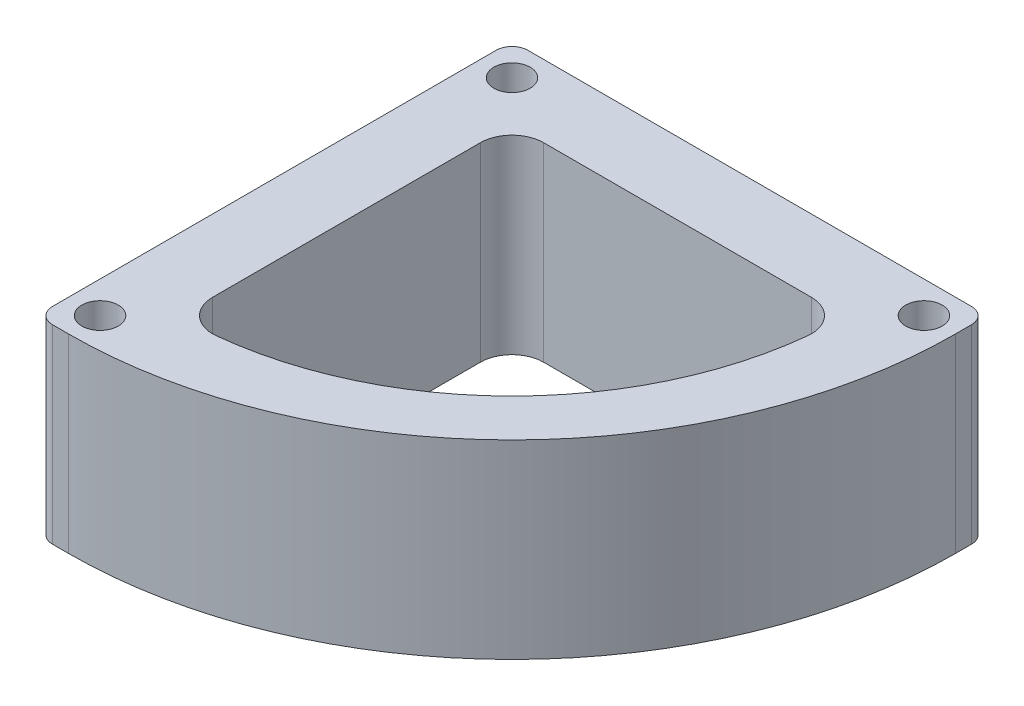
ISO-10303-21;
HEADER;
FILE_DESCRIPTION(('STEP AP214'),'2;1');
FILE_NAME('part.step','',(''),(''),'','','');
FILE_SCHEMA(('AUTOMOTIVE_DESIGN { 1 0 10303 214 1 1 1 1 }'));
ENDSEC;
DATA;
#1=APPLICATION_CONTEXT('core data for automotive mechanical design processes');
#2=APPLICATION_PROTOCOL_DEFINITION('international standard','automotive_design',2000,#1);
#3=PRODUCT_CONTEXT('',#1,'mechanical');
#4=PRODUCT('Part','Part','',(#3));
#5=PRODUCT_RELATED_PRODUCT_CATEGORY('part','',(#4));
#6=PRODUCT_DEFINITION_FORMATION('','',#4);
#7=PRODUCT_DEFINITION_CONTEXT('part definition',#1,'design');
#8=PRODUCT_DEFINITION('design','',#6,#7);
#9=PRODUCT_DEFINITION_SHAPE('','',#8);
#10=(LENGTH_UNIT() NAMED_UNIT(*) SI_UNIT(.MILLI.,.METRE.));
#11=(NAMED_UNIT(*) PLANE_ANGLE_UNIT() SI_UNIT($,.RADIAN.));
#12=(NAMED_UNIT(*) SI_UNIT($,.STERADIAN.) SOLID_ANGLE_UNIT());
#13=UNCERTAINTY_MEASURE_WITH_UNIT(LENGTH_MEASURE(1.E-05),#10,'distance_accuracy_value','');
#14=(GEOMETRIC_REPRESENTATION_CONTEXT(3) GLOBAL_UNCERTAINTY_ASSIGNED_CONTEXT((#13)) GLOBAL_UNIT_ASSIGNED_CONTEXT((#10,
#11,#12)) REPRESENTATION_CONTEXT('',''));
#15=CARTESIAN_POINT('',(0.,0.,0.));
#16=DIRECTION('',(0.,0.,1.));
#17=DIRECTION('',(1.,0.,0.));
#18=AXIS2_PLACEMENT_3D('',#15,#16,#17);
#19=CARTESIAN_POINT('',(0.,12.,0.));
#20=DIRECTION('',(0.,1.,0.));
#21=DIRECTION('',(0.,0.,1.));
#22=AXIS2_PLACEMENT_3D('',#19,#20,#21);
#23=PLANE('',#22);
#24=CARTESIAN_POINT('',(-13.,12.,13.));
#25=DIRECTION('',(0.,1.,0.));
#26=DIRECTION('',(0.,0.,1.));
#27=AXIS2_PLACEMENT_3D('',#24,#25,#26);
#28=CIRCLE('',#27,1.15);
#29=CARTESIAN_POINT('',(-13.,12.,14.15));
#30=VERTEX_POINT('',#29);
#31=EDGE_CURVE('E220',#30,#30,#28,.T.);
#32=ORIENTED_EDGE('',*,*,#31,.F.);
#33=EDGE_LOOP('',(#32));
#34=FACE_BOUND('',#33,.T.);
#35=CARTESIAN_POINT('',(13.,12.,-13.));
#36=DIRECTION('',(0.,1.,0.));
#37=DIRECTION('',(0.,0.,1.));
#38=AXIS2_PLACEMENT_3D('',#35,#36,#37);
#39=CIRCLE('',#38,1.15);
#40=CARTESIAN_POINT('',(13.,12.,-11.85));
#41=VERTEX_POINT('',#40);
#42=EDGE_CURVE('E228',#41,#41,#39,.T.);
#43=ORIENTED_EDGE('',*,*,#42,.F.);
#44=EDGE_LOOP('',(#43));
#45=FACE_BOUND('',#44,.T.);
#46=DIRECTION('',(-1.,0.,0.));
#47=VECTOR('',#46,1.);
#48=CARTESIAN_POINT('',(-15.,12.,-15.));
#49=LINE('',#48,#47);
#50=CARTESIAN_POINT('',(14.,12.,-15.));
#51=VERTEX_POINT('',#50);
#52=CARTESIAN_POINT('',(-14.,12.,-15.));
#53=VERTEX_POINT('',#52);
#54=EDGE_CURVE('E240',#51,#53,#49,.T.);
#55=ORIENTED_EDGE('',*,*,#54,.T.);
#56=CARTESIAN_POINT('',(-14.,12.,-14.));
#57=DIRECTION('',(0.,1.,0.));
#58=DIRECTION('',(0.,0.,1.));
#59=AXIS2_PLACEMENT_3D('',#56,#57,#58);
#60=CIRCLE('',#59,1.);
#61=CARTESIAN_POINT('',(-15.,12.,-14.));
#62=VERTEX_POINT('',#61);
#63=EDGE_CURVE('E309',#53,#62,#60,.T.);
#64=ORIENTED_EDGE('',*,*,#63,.T.);
#65=DIRECTION('',(0.,0.,1.));
#66=VECTOR('',#65,1.);
#67=CARTESIAN_POINT('',(-15.,12.,-15.));
#68=LINE('',#67,#66);
#69=CARTESIAN_POINT('',(-15.,12.,14.));
#70=VERTEX_POINT('',#69);
#71=EDGE_CURVE('E245',#62,#70,#68,.T.);
#72=ORIENTED_EDGE('',*,*,#71,.T.);
#73=CARTESIAN_POINT('',(-14.,12.,14.));
#74=DIRECTION('',(0.,1.,0.));
#75=DIRECTION('',(0.,0.,1.));
#76=AXIS2_PLACEMENT_3D('',#73,#74,#75);
#77=CIRCLE('',#76,1.);
#78=CARTESIAN_POINT('',(-14.,12.,15.));
#79=VERTEX_POINT('',#78);
#80=EDGE_CURVE('E303',#70,#79,#77,.T.);
#81=ORIENTED_EDGE('',*,*,#80,.T.);
#82=DIRECTION('',(1.,0.,0.));
#83=VECTOR('',#82,1.);
#84=CARTESIAN_POINT('',(-15.,12.,15.));
#85=LINE('',#84,#83);
#86=CARTESIAN_POINT('',(-13.,12.,15.));
#87=VERTEX_POINT('',#86);
#88=EDGE_CURVE('E249',#79,#87,#85,.T.);
#89=ORIENTED_EDGE('',*,*,#88,.T.);
#90=CARTESIAN_POINT('',(-13.,12.,-13.));
#91=DIRECTION('',(0.,1.,0.));
#92=DIRECTION('',(0.,0.,1.));
#93=AXIS2_PLACEMENT_3D('',#90,#91,#92);
#94=CIRCLE('',#93,28.);
#95=CARTESIAN_POINT('',(15.,12.,-13.));
#96=VERTEX_POINT('',#95);
#97=EDGE_CURVE('E277',#87,#96,#94,.T.);
#98=ORIENTED_EDGE('',*,*,#97,.T.);
#99=DIRECTION('',(0.,0.,-1.));
#100=VECTOR('',#99,1.);
#101=CARTESIAN_POINT('',(15.,12.,-15.));
#102=LINE('',#101,#100);
#103=CARTESIAN_POINT('',(15.,12.,-14.));
#104=VERTEX_POINT('',#103);
#105=EDGE_CURVE('E236',#96,#104,#102,.T.);
#106=ORIENTED_EDGE('',*,*,#105,.T.);
#107=CARTESIAN_POINT('',(14.,12.,-14.));
#108=DIRECTION('',(0.,1.,0.));
#109=DIRECTION('',(0.,0.,1.));
#110=AXIS2_PLACEMENT_3D('',#107,#108,#109);
#111=CIRCLE('',#110,1.);
#112=EDGE_CURVE('E306',#104,#51,#111,.T.);
#113=ORIENTED_EDGE('',*,*,#112,.T.);
#114=EDGE_LOOP('',(#55,#64,#72,#81,#89,#98,#106,#113));
#115=FACE_BOUND('',#114,.T.);
#116=CARTESIAN_POINT('',(-13.,12.,-13.));
#117=DIRECTION('',(0.,1.,0.));
#118=DIRECTION('',(0.,0.,-1.));
#119=AXIS2_PLACEMENT_3D('',#116,#117,#118);
#120=CIRCLE('',#119,1.15);
#121=CARTESIAN_POINT('',(-13.,12.,-14.15));
#122=VERTEX_POINT('',#121);
#123=EDGE_CURVE('E212',#122,#122,#120,.T.);
#124=ORIENTED_EDGE('',*,*,#123,.F.);
#125=EDGE_LOOP('',(#124));
#126=FACE_BOUND('',#125,.T.);
#127=DIRECTION('',(0.,0.,-1.));
#128=VECTOR('',#127,1.);
#129=CARTESIAN_POINT('',(-10.4472218138456,12.,0.));
#130=LINE('',#129,#128);
#131=CARTESIAN_POINT('',(-10.4472218138456,12.,8.44722181384558));
#132=VERTEX_POINT('',#131);
#133=CARTESIAN_POINT('',(-10.4472218138456,12.,-8.44722181384558));
#134=VERTEX_POINT('',#133);
#135=EDGE_CURVE('E206',#132,#134,#130,.T.);
#136=ORIENTED_EDGE('',*,*,#135,.T.);
#137=CARTESIAN_POINT('',(-8.44722181384559,12.,-8.44722181384559));
#138=DIRECTION('',(0.,1.,0.));
#139=DIRECTION('',(0.,0.,1.));
#140=AXIS2_PLACEMENT_3D('',#137,#138,#139);
#141=CIRCLE('',#140,2.);
#142=CARTESIAN_POINT('',(-8.44722181384559,12.,-10.4472218138456));
#143=VERTEX_POINT('',#142);
#144=EDGE_CURVE('E143',#134,#143,#141,.F.);
#145=ORIENTED_EDGE('',*,*,#144,.T.);
#146=DIRECTION('',(1.,0.,0.));
#147=VECTOR('',#146,1.);
#148=CARTESIAN_POINT('',(0.,12.,-10.4472218138456));
#149=LINE('',#148,#147);
#150=CARTESIAN_POINT('',(8.44722181384559,12.,-10.4472218138456));
#151=VERTEX_POINT('',#150);
#152=EDGE_CURVE('E147',#143,#151,#149,.T.);
#153=ORIENTED_EDGE('',*,*,#152,.T.);
#154=CARTESIAN_POINT('',(8.44722181384559,12.,-8.44722181384559));
#155=DIRECTION('',(0.,1.,0.));
#156=DIRECTION('',(0.,0.,1.));
#157=AXIS2_PLACEMENT_3D('',#154,#155,#156);
#158=CIRCLE('',#157,2.00000000000001);
#159=CARTESIAN_POINT('',(10.4361106167605,12.,-8.23669549805611));
#160=VERTEX_POINT('',#159);
#161=EDGE_CURVE('E194',#151,#160,#158,.F.);
#162=ORIENTED_EDGE('',*,*,#161,.T.);
#163=CARTESIAN_POINT('',(-10.4472218138457,12.,-10.4472218138457));
#164=DIRECTION('',(0.,1.,0.));
#165=DIRECTION('',(0.,0.,1.));
#166=AXIS2_PLACEMENT_3D('',#163,#164,#165);
#167=CIRCLE('',#166,21.0000000000001);
#168=CARTESIAN_POINT('',(-8.2366954980561,12.,10.4361106167605));
#169=VERTEX_POINT('',#168);
#170=EDGE_CURVE('E198',#160,#169,#167,.F.);
#171=ORIENTED_EDGE('',*,*,#170,.T.);
#172=CARTESIAN_POINT('',(-8.44722181384559,12.,8.44722181384559));
#173=DIRECTION('',(0.,1.,0.));
#174=DIRECTION('',(0.,0.,1.));
#175=AXIS2_PLACEMENT_3D('',#172,#173,#174);
#176=CIRCLE('',#175,2.);
#177=EDGE_CURVE('E202',#169,#132,#176,.F.);
#178=ORIENTED_EDGE('',*,*,#177,.T.);
#179=EDGE_LOOP('',(#136,#145,#153,#162,#171,#178));
#180=FACE_BOUND('',#179,.T.);
#181=ADVANCED_FACE('F38',(#34,#45,#115,#126,#180),#23,.T.);
#182=CARTESIAN_POINT('',(0.,0.,0.));
#183=DIRECTION('',(0.,1.,0.));
#184=DIRECTION('',(0.,0.,1.));
#185=AXIS2_PLACEMENT_3D('',#182,#183,#184);
#186=PLANE('',#185);
#187=CARTESIAN_POINT('',(-13.,0.,-13.));
#188=DIRECTION('',(0.,1.,0.));
#189=DIRECTION('',(0.,0.,-1.));
#190=AXIS2_PLACEMENT_3D('',#187,#188,#189);
#191=CIRCLE('',#190,1.15);
#192=CARTESIAN_POINT('',(-13.,0.,-14.15));
#193=VERTEX_POINT('',#192);
#194=EDGE_CURVE('E211',#193,#193,#191,.T.);
#195=ORIENTED_EDGE('',*,*,#194,.T.);
#196=EDGE_LOOP('',(#195));
#197=FACE_BOUND('',#196,.T.);
#198=CARTESIAN_POINT('',(-13.,0.,13.));
#199=DIRECTION('',(0.,1.,0.));
#200=DIRECTION('',(0.,0.,1.));
#201=AXIS2_PLACEMENT_3D('',#198,#199,#200);
#202=CIRCLE('',#201,1.15);
#203=CARTESIAN_POINT('',(-13.,0.,14.15));
#204=VERTEX_POINT('',#203);
#205=EDGE_CURVE('E216',#204,#204,#202,.T.);
#206=ORIENTED_EDGE('',*,*,#205,.T.);
#207=EDGE_LOOP('',(#206));
#208=FACE_BOUND('',#207,.T.);
#209=CARTESIAN_POINT('',(13.,0.,-13.));
#210=DIRECTION('',(0.,1.,0.));
#211=DIRECTION('',(0.,0.,1.));
#212=AXIS2_PLACEMENT_3D('',#209,#210,#211);
#213=CIRCLE('',#212,1.15);
#214=CARTESIAN_POINT('',(13.,0.,-11.85));
#215=VERTEX_POINT('',#214);
#216=EDGE_CURVE('E224',#215,#215,#213,.T.);
#217=ORIENTED_EDGE('',*,*,#216,.T.);
#218=EDGE_LOOP('',(#217));
#219=FACE_BOUND('',#218,.T.);
#220=DIRECTION('',(0.,0.,1.));
#221=VECTOR('',#220,1.);
#222=CARTESIAN_POINT('',(-15.,0.,-15.));
#223=LINE('',#222,#221);
#224=CARTESIAN_POINT('',(-15.,0.,-14.));
#225=VERTEX_POINT('',#224);
#226=CARTESIAN_POINT('',(-15.,0.,14.));
#227=VERTEX_POINT('',#226);
#228=EDGE_CURVE('E260',#225,#227,#223,.T.);
#229=ORIENTED_EDGE('',*,*,#228,.F.);
#230=CARTESIAN_POINT('',(-14.,0.,-14.));
#231=DIRECTION('',(0.,1.,0.));
#232=DIRECTION('',(0.,0.,1.));
#233=AXIS2_PLACEMENT_3D('',#230,#231,#232);
#234=CIRCLE('',#233,1.);
#235=CARTESIAN_POINT('',(-14.,0.,-15.));
#236=VERTEX_POINT('',#235);
#237=EDGE_CURVE('E293',#225,#236,#234,.F.);
#238=ORIENTED_EDGE('',*,*,#237,.T.);
#239=DIRECTION('',(-1.,0.,0.));
#240=VECTOR('',#239,1.);
#241=CARTESIAN_POINT('',(-15.,0.,-15.));
#242=LINE('',#241,#240);
#243=CARTESIAN_POINT('',(14.,0.,-15.));
#244=VERTEX_POINT('',#243);
#245=EDGE_CURVE('E256',#244,#236,#242,.T.);
#246=ORIENTED_EDGE('',*,*,#245,.F.);
#247=CARTESIAN_POINT('',(14.,0.,-14.));
#248=DIRECTION('',(0.,1.,0.));
#249=DIRECTION('',(0.,0.,1.));
#250=AXIS2_PLACEMENT_3D('',#247,#248,#249);
#251=CIRCLE('',#250,1.);
#252=CARTESIAN_POINT('',(15.,0.,-14.));
#253=VERTEX_POINT('',#252);
#254=EDGE_CURVE('E290',#244,#253,#251,.F.);
#255=ORIENTED_EDGE('',*,*,#254,.T.);
#256=DIRECTION('',(0.,0.,-1.));
#257=VECTOR('',#256,1.);
#258=CARTESIAN_POINT('',(15.,0.,-15.));
#259=LINE('',#258,#257);
#260=CARTESIAN_POINT('',(15.,0.,-13.));
#261=VERTEX_POINT('',#260);
#262=EDGE_CURVE('E232',#261,#253,#259,.T.);
#263=ORIENTED_EDGE('',*,*,#262,.F.);
#264=CARTESIAN_POINT('',(-13.,0.,-13.));
#265=DIRECTION('',(0.,1.,0.));
#266=DIRECTION('',(0.,0.,1.));
#267=AXIS2_PLACEMENT_3D('',#264,#265,#266);
#268=CIRCLE('',#267,28.);
#269=CARTESIAN_POINT('',(-13.,0.,15.));
#270=VERTEX_POINT('',#269);
#271=EDGE_CURVE('E269',#261,#270,#268,.F.);
#272=ORIENTED_EDGE('',*,*,#271,.T.);
#273=DIRECTION('',(1.,0.,0.));
#274=VECTOR('',#273,1.);
#275=CARTESIAN_POINT('',(-15.,0.,15.));
#276=LINE('',#275,#274);
#277=CARTESIAN_POINT('',(-14.,0.,15.));
#278=VERTEX_POINT('',#277);
#279=EDGE_CURVE('E241',#278,#270,#276,.T.);
#280=ORIENTED_EDGE('',*,*,#279,.F.);
#281=CARTESIAN_POINT('',(-14.,0.,14.));
#282=DIRECTION('',(0.,1.,0.));
#283=DIRECTION('',(0.,0.,1.));
#284=AXIS2_PLACEMENT_3D('',#281,#282,#283);
#285=CIRCLE('',#284,1.);
#286=EDGE_CURVE('E287',#278,#227,#285,.F.);
#287=ORIENTED_EDGE('',*,*,#286,.T.);
#288=EDGE_LOOP('',(#229,#238,#246,#255,#263,#272,#280,#287));
#289=FACE_BOUND('',#288,.T.);
#290=CARTESIAN_POINT('',(-8.44722181384559,0.,-8.44722181384559));
#291=DIRECTION('',(0.,1.,0.));
#292=DIRECTION('',(0.,0.,1.));
#293=AXIS2_PLACEMENT_3D('',#290,#291,#292);
#294=CIRCLE('',#293,2.);
#295=CARTESIAN_POINT('',(-8.44722181384559,0.,-10.4472218138456));
#296=VERTEX_POINT('',#295);
#297=CARTESIAN_POINT('',(-10.4472218138456,0.,-8.44722181384558));
#298=VERTEX_POINT('',#297);
#299=EDGE_CURVE('E62',#296,#298,#294,.T.);
#300=ORIENTED_EDGE('',*,*,#299,.T.);
#301=DIRECTION('',(0.,0.,1.));
#302=VECTOR('',#301,1.);
#303=CARTESIAN_POINT('',(-10.4472218138456,0.,8.44722181384558));
#304=LINE('',#303,#302);
#305=CARTESIAN_POINT('',(-10.4472218138456,0.,8.44722181384558));
#306=VERTEX_POINT('',#305);
#307=EDGE_CURVE('E151',#298,#306,#304,.T.);
#308=ORIENTED_EDGE('',*,*,#307,.T.);
#309=CARTESIAN_POINT('',(-8.44722181384559,0.,8.44722181384559));
#310=DIRECTION('',(0.,1.,0.));
#311=DIRECTION('',(0.,0.,-1.));
#312=AXIS2_PLACEMENT_3D('',#309,#310,#311);
#313=CIRCLE('',#312,2.);
#314=CARTESIAN_POINT('',(-8.2366954980561,0.,10.4361106167605));
#315=VERTEX_POINT('',#314);
#316=EDGE_CURVE('E158',#306,#315,#313,.T.);
#317=ORIENTED_EDGE('',*,*,#316,.T.);
#318=CARTESIAN_POINT('',(-10.4472218138457,0.,-10.4472218138457));
#319=DIRECTION('',(0.,1.,0.));
#320=DIRECTION('',(0.,0.,-1.));
#321=AXIS2_PLACEMENT_3D('',#318,#319,#320);
#322=CIRCLE('',#321,21.0000000000001);
#323=CARTESIAN_POINT('',(10.4361106167605,0.,-8.23669549805611));
#324=VERTEX_POINT('',#323);
#325=EDGE_CURVE('E169',#315,#324,#322,.T.);
#326=ORIENTED_EDGE('',*,*,#325,.T.);
#327=CARTESIAN_POINT('',(8.44722181384559,0.,-8.44722181384559));
#328=DIRECTION('',(0.,1.,0.));
#329=DIRECTION('',(0.,0.,1.));
#330=AXIS2_PLACEMENT_3D('',#327,#328,#329);
#331=CIRCLE('',#330,2.00000000000001);
#332=CARTESIAN_POINT('',(8.44722181384559,0.,-10.4472218138456));
#333=VERTEX_POINT('',#332);
#334=EDGE_CURVE('E173',#324,#333,#331,.T.);
#335=ORIENTED_EDGE('',*,*,#334,.T.);
#336=DIRECTION('',(-1.,0.,0.));
#337=VECTOR('',#336,1.);
#338=CARTESIAN_POINT('',(8.44722181384559,0.,-10.4472218138456));
#339=LINE('',#338,#337);
#340=EDGE_CURVE('E163',#333,#296,#339,.T.);
#341=ORIENTED_EDGE('',*,*,#340,.T.);
#342=EDGE_LOOP('',(#300,#308,#317,#326,#335,#341));
#343=FACE_BOUND('',#342,.T.);
#344=ADVANCED_FACE('F161',(#197,#208,#219,#289,#343),#186,.F.);
#345=CARTESIAN_POINT('',(15.,12.,-15.));
#346=DIRECTION('',(-1.,0.,0.));
#347=DIRECTION('',(0.,0.,1.));
#348=AXIS2_PLACEMENT_3D('',#345,#346,#347);
#349=PLANE('',#348);
#350=ORIENTED_EDGE('',*,*,#262,.T.);
#351=DIRECTION('',(0.,-1.,0.));
#352=VECTOR('',#351,1.);
#353=CARTESIAN_POINT('',(15.,12.,-14.));
#354=LINE('',#353,#352);
#355=EDGE_CURVE('E47',#253,#104,#354,.F.);
#356=ORIENTED_EDGE('',*,*,#355,.T.);
#357=ORIENTED_EDGE('',*,*,#105,.F.);
#358=DIRECTION('',(0.,-1.,0.));
#359=VECTOR('',#358,1.);
#360=CARTESIAN_POINT('',(15.,12.,-13.));
#361=LINE('',#360,#359);
#362=EDGE_CURVE('E252',#96,#261,#361,.T.);
#363=ORIENTED_EDGE('',*,*,#362,.T.);
#364=EDGE_LOOP('',(#350,#356,#357,#363));
#365=FACE_BOUND('',#364,.T.);
#366=ADVANCED_FACE('F315',(#365),#349,.F.);
#367=CARTESIAN_POINT('',(-15.,12.,-15.));
#368=DIRECTION('',(0.,0.,1.));
#369=DIRECTION('',(1.,0.,0.));
#370=AXIS2_PLACEMENT_3D('',#367,#368,#369);
#371=PLANE('',#370);
#372=ORIENTED_EDGE('',*,*,#245,.T.);
#373=DIRECTION('',(0.,-1.,0.));
#374=VECTOR('',#373,1.);
#375=CARTESIAN_POINT('',(-14.,12.,-15.));
#376=LINE('',#375,#374);
#377=EDGE_CURVE('E300',#236,#53,#376,.F.);
#378=ORIENTED_EDGE('',*,*,#377,.T.);
#379=ORIENTED_EDGE('',*,*,#54,.F.);
#380=DIRECTION('',(0.,-1.,0.));
#381=VECTOR('',#380,1.);
#382=CARTESIAN_POINT('',(14.,12.,-15.));
#383=LINE('',#382,#381);
#384=EDGE_CURVE('E296',#51,#244,#383,.T.);
#385=ORIENTED_EDGE('',*,*,#384,.T.);
#386=EDGE_LOOP('',(#372,#378,#379,#385));
#387=FACE_BOUND('',#386,.T.);
#388=ADVANCED_FACE('F328',(#387),#371,.F.);
#389=CARTESIAN_POINT('',(-15.,12.,-15.));
#390=DIRECTION('',(1.,0.,0.));
#391=DIRECTION('',(0.,0.,-1.));
#392=AXIS2_PLACEMENT_3D('',#389,#390,#391);
#393=PLANE('',#392);
#394=ORIENTED_EDGE('',*,*,#71,.F.);
#395=DIRECTION('',(0.,-1.,0.));
#396=VECTOR('',#395,1.);
#397=CARTESIAN_POINT('',(-15.,12.,-14.));
#398=LINE('',#397,#396);
#399=EDGE_CURVE('E283',#62,#225,#398,.T.);
#400=ORIENTED_EDGE('',*,*,#399,.T.);
#401=ORIENTED_EDGE('',*,*,#228,.T.);
#402=DIRECTION('',(0.,-1.,0.));
#403=VECTOR('',#402,1.);
#404=CARTESIAN_POINT('',(-15.,12.,14.));
#405=LINE('',#404,#403);
#406=EDGE_CURVE('E280',#227,#70,#405,.F.);
#407=ORIENTED_EDGE('',*,*,#406,.T.);
#408=EDGE_LOOP('',(#394,#400,#401,#407));
#409=FACE_BOUND('',#408,.T.);
#410=ADVANCED_FACE('F338',(#409),#393,.F.);
#411=CARTESIAN_POINT('',(-15.,12.,15.));
#412=DIRECTION('',(0.,0.,-1.));
#413=DIRECTION('',(-1.,0.,0.));
#414=AXIS2_PLACEMENT_3D('',#411,#412,#413);
#415=PLANE('',#414);
#416=ORIENTED_EDGE('',*,*,#88,.F.);
#417=DIRECTION('',(0.,-1.,0.));
#418=VECTOR('',#417,1.);
#419=CARTESIAN_POINT('',(-14.,12.,15.));
#420=LINE('',#419,#418);
#421=EDGE_CURVE('E11',#79,#278,#420,.T.);
#422=ORIENTED_EDGE('',*,*,#421,.T.);
#423=ORIENTED_EDGE('',*,*,#279,.T.);
#424=DIRECTION('',(0.,-1.,0.));
#425=VECTOR('',#424,1.);
#426=CARTESIAN_POINT('',(-13.,12.,15.));
#427=LINE('',#426,#425);
#428=EDGE_CURVE('E273',#270,#87,#427,.F.);
#429=ORIENTED_EDGE('',*,*,#428,.T.);
#430=EDGE_LOOP('',(#416,#422,#423,#429));
#431=FACE_BOUND('',#430,.T.);
#432=ADVANCED_FACE('F346',(#431),#415,.F.);
#433=CARTESIAN_POINT('',(13.,12.,-13.));
#434=DIRECTION('',(0.,-1.,0.));
#435=DIRECTION('',(0.,0.,-1.));
#436=AXIS2_PLACEMENT_3D('',#433,#434,#435);
#437=CYLINDRICAL_SURFACE('',#436,1.15);
#438=ORIENTED_EDGE('',*,*,#42,.T.);
#439=EDGE_LOOP('',(#438));
#440=FACE_BOUND('',#439,.T.);
#441=ORIENTED_EDGE('',*,*,#216,.F.);
#442=EDGE_LOOP('',(#441));
#443=FACE_BOUND('',#442,.T.);
#444=ADVANCED_FACE('F375',(#440,#443),#437,.F.);
#445=CARTESIAN_POINT('',(-13.,12.,13.));
#446=DIRECTION('',(0.,-1.,0.));
#447=DIRECTION('',(0.,0.,-1.));
#448=AXIS2_PLACEMENT_3D('',#445,#446,#447);
#449=CYLINDRICAL_SURFACE('',#448,1.15);
#450=ORIENTED_EDGE('',*,*,#31,.T.);
#451=EDGE_LOOP('',(#450));
#452=FACE_BOUND('',#451,.T.);
#453=ORIENTED_EDGE('',*,*,#205,.F.);
#454=EDGE_LOOP('',(#453));
#455=FACE_BOUND('',#454,.T.);
#456=ADVANCED_FACE('F359',(#452,#455),#449,.F.);
#457=CARTESIAN_POINT('',(-13.,12.,-13.));
#458=DIRECTION('',(0.,-1.,0.));
#459=DIRECTION('',(0.,0.,-1.));
#460=AXIS2_PLACEMENT_3D('',#457,#458,#459);
#461=CYLINDRICAL_SURFACE('',#460,1.15);
#462=ORIENTED_EDGE('',*,*,#123,.T.);
#463=EDGE_LOOP('',(#462));
#464=FACE_BOUND('',#463,.T.);
#465=ORIENTED_EDGE('',*,*,#194,.F.);
#466=EDGE_LOOP('',(#465));
#467=FACE_BOUND('',#466,.T.);
#468=ADVANCED_FACE('F351',(#464,#467),#461,.F.);
#469=CARTESIAN_POINT('',(-13.,12.,-13.));
#470=DIRECTION('',(0.,-1.,0.));
#471=DIRECTION('',(0.,0.,-1.));
#472=AXIS2_PLACEMENT_3D('',#469,#470,#471);
#473=CYLINDRICAL_SURFACE('',#472,28.);
#474=ORIENTED_EDGE('',*,*,#97,.F.);
#475=ORIENTED_EDGE('',*,*,#428,.F.);
#476=ORIENTED_EDGE('',*,*,#271,.F.);
#477=ORIENTED_EDGE('',*,*,#362,.F.);
#478=EDGE_LOOP('',(#474,#475,#476,#477));
#479=FACE_BOUND('',#478,.T.);
#480=ADVANCED_FACE('F349',(#479),#473,.T.);
#481=CARTESIAN_POINT('',(-14.,12.,-14.));
#482=DIRECTION('',(0.,-1.,0.));
#483=DIRECTION('',(0.,0.,-1.));
#484=AXIS2_PLACEMENT_3D('',#481,#482,#483);
#485=CYLINDRICAL_SURFACE('',#484,1.);
#486=ORIENTED_EDGE('',*,*,#63,.F.);
#487=ORIENTED_EDGE('',*,*,#377,.F.);
#488=ORIENTED_EDGE('',*,*,#237,.F.);
#489=ORIENTED_EDGE('',*,*,#399,.F.);
#490=EDGE_LOOP('',(#486,#487,#488,#489));
#491=FACE_BOUND('',#490,.T.);
#492=ADVANCED_FACE('F335',(#491),#485,.T.);
#493=CARTESIAN_POINT('',(14.,12.,-14.));
#494=DIRECTION('',(0.,-1.,0.));
#495=DIRECTION('',(0.,0.,-1.));
#496=AXIS2_PLACEMENT_3D('',#493,#494,#495);
#497=CYLINDRICAL_SURFACE('',#496,1.);
#498=ORIENTED_EDGE('',*,*,#112,.F.);
#499=ORIENTED_EDGE('',*,*,#355,.F.);
#500=ORIENTED_EDGE('',*,*,#254,.F.);
#501=ORIENTED_EDGE('',*,*,#384,.F.);
#502=EDGE_LOOP('',(#498,#499,#500,#501));
#503=FACE_BOUND('',#502,.T.);
#504=ADVANCED_FACE('F325',(#503),#497,.T.);
#505=CARTESIAN_POINT('',(-14.,12.,14.));
#506=DIRECTION('',(0.,-1.,0.));
#507=DIRECTION('',(0.,0.,-1.));
#508=AXIS2_PLACEMENT_3D('',#505,#506,#507);
#509=CYLINDRICAL_SURFACE('',#508,1.);
#510=ORIENTED_EDGE('',*,*,#80,.F.);
#511=ORIENTED_EDGE('',*,*,#406,.F.);
#512=ORIENTED_EDGE('',*,*,#286,.F.);
#513=ORIENTED_EDGE('',*,*,#421,.F.);
#514=EDGE_LOOP('',(#510,#511,#512,#513));
#515=FACE_BOUND('',#514,.T.);
#516=ADVANCED_FACE('F40',(#515),#509,.T.);
#517=CARTESIAN_POINT('',(-8.44722181384559,22.,-8.44722181384559));
#518=DIRECTION('',(0.,-1.,0.));
#519=DIRECTION('',(0.,0.,-1.));
#520=AXIS2_PLACEMENT_3D('',#517,#518,#519);
#521=CYLINDRICAL_SURFACE('',#520,2.);
#522=DIRECTION('',(0.,-1.,0.));
#523=VECTOR('',#522,1.);
#524=CARTESIAN_POINT('',(-10.4472218138456,22.,-8.44722181384558));
#525=LINE('',#524,#523);
#526=EDGE_CURVE('E139',#134,#298,#525,.T.);
#527=ORIENTED_EDGE('',*,*,#526,.T.);
#528=ORIENTED_EDGE('',*,*,#299,.F.);
#529=DIRECTION('',(0.,-1.,0.));
#530=VECTOR('',#529,1.);
#531=CARTESIAN_POINT('',(-8.44722181384559,22.,-10.4472218138456));
#532=LINE('',#531,#530);
#533=EDGE_CURVE('E178',#143,#296,#532,.T.);
#534=ORIENTED_EDGE('',*,*,#533,.F.);
#535=ORIENTED_EDGE('',*,*,#144,.F.);
#536=EDGE_LOOP('',(#527,#528,#534,#535));
#537=FACE_BOUND('',#536,.T.);
#538=ADVANCED_FACE('F141',(#537),#521,.F.);
#539=CARTESIAN_POINT('',(-10.4472218138456,22.,8.44722181384558));
#540=DIRECTION('',(1.,0.,0.));
#541=DIRECTION('',(0.,0.,-1.));
#542=AXIS2_PLACEMENT_3D('',#539,#540,#541);
#543=PLANE('',#542);
#544=DIRECTION('',(0.,-1.,0.));
#545=VECTOR('',#544,1.);
#546=CARTESIAN_POINT('',(-10.4472218138456,22.,8.44722181384558));
#547=LINE('',#546,#545);
#548=EDGE_CURVE('E148',#132,#306,#547,.T.);
#549=ORIENTED_EDGE('',*,*,#548,.T.);
#550=ORIENTED_EDGE('',*,*,#307,.F.);
#551=ORIENTED_EDGE('',*,*,#526,.F.);
#552=ORIENTED_EDGE('',*,*,#135,.F.);
#553=EDGE_LOOP('',(#549,#550,#551,#552));
#554=FACE_BOUND('',#553,.T.);
#555=ADVANCED_FACE('F152',(#554),#543,.T.);
#556=CARTESIAN_POINT('',(-8.44722181384559,22.,8.44722181384559));
#557=DIRECTION('',(0.,-1.,0.));
#558=DIRECTION('',(0.,0.,-1.));
#559=AXIS2_PLACEMENT_3D('',#556,#557,#558);
#560=CYLINDRICAL_SURFACE('',#559,2.);
#561=DIRECTION('',(0.,-1.,0.));
#562=VECTOR('',#561,1.);
#563=CARTESIAN_POINT('',(-8.2366954980561,22.,10.4361106167605));
#564=LINE('',#563,#562);
#565=EDGE_CURVE('E186',#169,#315,#564,.T.);
#566=ORIENTED_EDGE('',*,*,#565,.T.);
#567=ORIENTED_EDGE('',*,*,#316,.F.);
#568=ORIENTED_EDGE('',*,*,#548,.F.);
#569=ORIENTED_EDGE('',*,*,#177,.F.);
#570=EDGE_LOOP('',(#566,#567,#568,#569));
#571=FACE_BOUND('',#570,.T.);
#572=ADVANCED_FACE('F435',(#571),#560,.F.);
#573=CARTESIAN_POINT('',(-10.4472218138457,22.,-10.4472218138457));
#574=DIRECTION('',(0.,-1.,0.));
#575=DIRECTION('',(0.,0.,-1.));
#576=AXIS2_PLACEMENT_3D('',#573,#574,#575);
#577=CYLINDRICAL_SURFACE('',#576,21.0000000000001);
#578=DIRECTION('',(0.,-1.,0.));
#579=VECTOR('',#578,1.);
#580=CARTESIAN_POINT('',(10.4361106167605,22.,-8.23669549805611));
#581=LINE('',#580,#579);
#582=EDGE_CURVE('E183',#160,#324,#581,.T.);
#583=ORIENTED_EDGE('',*,*,#582,.T.);
#584=ORIENTED_EDGE('',*,*,#325,.F.);
#585=ORIENTED_EDGE('',*,*,#565,.F.);
#586=ORIENTED_EDGE('',*,*,#170,.F.);
#587=EDGE_LOOP('',(#583,#584,#585,#586));
#588=FACE_BOUND('',#587,.T.);
#589=ADVANCED_FACE('F442',(#588),#577,.F.);
#590=CARTESIAN_POINT('',(8.44722181384559,22.,-8.44722181384559));
#591=DIRECTION('',(0.,-1.,0.));
#592=DIRECTION('',(0.,0.,-1.));
#593=AXIS2_PLACEMENT_3D('',#590,#591,#592);
#594=CYLINDRICAL_SURFACE('',#593,2.00000000000001);
#595=DIRECTION('',(0.,-1.,0.));
#596=VECTOR('',#595,1.);
#597=CARTESIAN_POINT('',(8.44722181384559,22.,-10.4472218138456));
#598=LINE('',#597,#596);
#599=EDGE_CURVE('E54',#151,#333,#598,.T.);
#600=ORIENTED_EDGE('',*,*,#599,.T.);
#601=ORIENTED_EDGE('',*,*,#334,.F.);
#602=ORIENTED_EDGE('',*,*,#582,.F.);
#603=ORIENTED_EDGE('',*,*,#161,.F.);
#604=EDGE_LOOP('',(#600,#601,#602,#603));
#605=FACE_BOUND('',#604,.T.);
#606=ADVANCED_FACE('F450',(#605),#594,.F.);
#607=CARTESIAN_POINT('',(8.44722181384559,22.,-10.4472218138456));
#608=DIRECTION('',(0.,0.,1.));
#609=DIRECTION('',(1.,0.,0.));
#610=AXIS2_PLACEMENT_3D('',#607,#608,#609);
#611=PLANE('',#610);
#612=ORIENTED_EDGE('',*,*,#533,.T.);
#613=ORIENTED_EDGE('',*,*,#340,.F.);
#614=ORIENTED_EDGE('',*,*,#599,.F.);
#615=ORIENTED_EDGE('',*,*,#152,.F.);
#616=EDGE_LOOP('',(#612,#613,#614,#615));
#617=FACE_BOUND('',#616,.T.);
#618=ADVANCED_FACE('F458',(#617),#611,.T.);
#619=CLOSED_SHELL('',(#181,#344,#366,#388,#410,#432,#444,#456,#468,#480,#492,#504,#516,#538,
#555,#572,#589,#606,#618));
#620=MANIFOLD_SOLID_BREP('B2',#619);
#621=ADVANCED_BREP_SHAPE_REPRESENTATION('',(#18,#620),#14);
#622=SHAPE_DEFINITION_REPRESENTATION(#9,#621);
ENDSEC;
END-ISO-10303-21;
